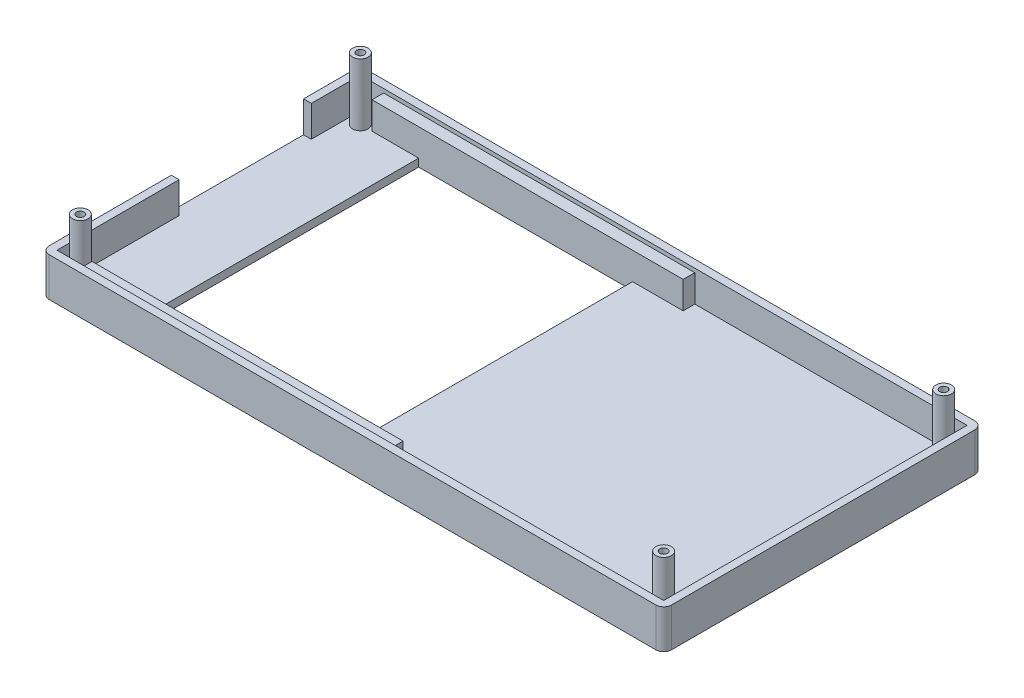
ISO-10303-21;
HEADER;
FILE_DESCRIPTION(('STEP AP214'),'2;1');
FILE_NAME('part.step','',(''),(''),'','','');
FILE_SCHEMA(('AUTOMOTIVE_DESIGN { 1 0 10303 214 1 1 1 1 }'));
ENDSEC;
DATA;
#1=APPLICATION_CONTEXT('core data for automotive mechanical design processes');
#2=APPLICATION_PROTOCOL_DEFINITION('international standard','automotive_design',2000,#1);
#3=PRODUCT_CONTEXT('',#1,'mechanical');
#4=PRODUCT('Part','Part','',(#3));
#5=PRODUCT_RELATED_PRODUCT_CATEGORY('part','',(#4));
#6=PRODUCT_DEFINITION_FORMATION('','',#4);
#7=PRODUCT_DEFINITION_CONTEXT('part definition',#1,'design');
#8=PRODUCT_DEFINITION('design','',#6,#7);
#9=PRODUCT_DEFINITION_SHAPE('','',#8);
#10=(LENGTH_UNIT() NAMED_UNIT(*) SI_UNIT(.MILLI.,.METRE.));
#11=(NAMED_UNIT(*) PLANE_ANGLE_UNIT() SI_UNIT($,.RADIAN.));
#12=(NAMED_UNIT(*) SI_UNIT($,.STERADIAN.) SOLID_ANGLE_UNIT());
#13=UNCERTAINTY_MEASURE_WITH_UNIT(LENGTH_MEASURE(1.E-05),#10,'distance_accuracy_value','');
#14=(GEOMETRIC_REPRESENTATION_CONTEXT(3) GLOBAL_UNCERTAINTY_ASSIGNED_CONTEXT((#13)) GLOBAL_UNIT_ASSIGNED_CONTEXT((#10,
#11,#12)) REPRESENTATION_CONTEXT('',''));
#15=CARTESIAN_POINT('',(0.,0.,0.));
#16=DIRECTION('',(0.,0.,1.));
#17=DIRECTION('',(1.,0.,0.));
#18=AXIS2_PLACEMENT_3D('',#15,#16,#17);
#19=CARTESIAN_POINT('',(0.,2.,0.));
#20=DIRECTION('',(0.,-1.,0.));
#21=DIRECTION('',(0.,0.,-1.));
#22=AXIS2_PLACEMENT_3D('',#19,#20,#21);
#23=PLANE('',#22);
#24=CARTESIAN_POINT('',(75.,2.,-36.));
#25=DIRECTION('',(0.,-1.,0.));
#26=DIRECTION('',(0.,0.,-1.));
#27=AXIS2_PLACEMENT_3D('',#24,#25,#26);
#28=CIRCLE('',#27,2.);
#29=CARTESIAN_POINT('',(75.,2.,-38.));
#30=VERTEX_POINT('',#29);
#31=EDGE_CURVE('E323',#30,#30,#28,.T.);
#32=ORIENTED_EDGE('',*,*,#31,.T.);
#33=EDGE_LOOP('',(#32));
#34=FACE_BOUND('',#33,.T.);
#35=CARTESIAN_POINT('',(75.,2.,36.));
#36=DIRECTION('',(0.,-1.,0.));
#37=DIRECTION('',(0.,0.,-1.));
#38=AXIS2_PLACEMENT_3D('',#35,#36,#37);
#39=CIRCLE('',#38,2.);
#40=CARTESIAN_POINT('',(75.,2.,34.));
#41=VERTEX_POINT('',#40);
#42=EDGE_CURVE('E474',#41,#41,#39,.F.);
#43=ORIENTED_EDGE('',*,*,#42,.F.);
#44=EDGE_LOOP('',(#43));
#45=FACE_BOUND('',#44,.T.);
#46=DIRECTION('',(0.,0.,1.));
#47=VECTOR('',#46,1.);
#48=CARTESIAN_POINT('',(-4.99999999999998,2.,-36.));
#49=LINE('',#48,#47);
#50=CARTESIAN_POINT('',(-4.99999999999998,2.,-36.));
#51=VERTEX_POINT('',#50);
#52=CARTESIAN_POINT('',(-4.99999999999997,2.,36.));
#53=VERTEX_POINT('',#52);
#54=EDGE_CURVE('E244',#51,#53,#49,.T.);
#55=ORIENTED_EDGE('',*,*,#54,.T.);
#56=DIRECTION('',(1.,0.,0.));
#57=VECTOR('',#56,1.);
#58=CARTESIAN_POINT('',(-72.,2.,36.));
#59=LINE('',#58,#57);
#60=CARTESIAN_POINT('',(8.,2.,36.));
#61=VERTEX_POINT('',#60);
#62=EDGE_CURVE('E254',#53,#61,#59,.T.);
#63=ORIENTED_EDGE('',*,*,#62,.T.);
#64=DIRECTION('',(0.,0.,-1.));
#65=VECTOR('',#64,1.);
#66=CARTESIAN_POINT('',(8.,2.,39.));
#67=LINE('',#66,#65);
#68=CARTESIAN_POINT('',(8.,2.,39.));
#69=VERTEX_POINT('',#68);
#70=EDGE_CURVE('E266',#69,#61,#67,.T.);
#71=ORIENTED_EDGE('',*,*,#70,.F.);
#72=DIRECTION('',(1.,0.,0.));
#73=VECTOR('',#72,1.);
#74=CARTESIAN_POINT('',(0.,2.,39.));
#75=LINE('',#74,#73);
#76=CARTESIAN_POINT('',(78.,2.,39.));
#77=VERTEX_POINT('',#76);
#78=EDGE_CURVE('E389',#69,#77,#75,.T.);
#79=ORIENTED_EDGE('',*,*,#78,.T.);
#80=DIRECTION('',(0.,0.,-1.));
#81=VECTOR('',#80,1.);
#82=CARTESIAN_POINT('',(78.,2.,0.));
#83=LINE('',#82,#81);
#84=CARTESIAN_POINT('',(78.,2.,-39.));
#85=VERTEX_POINT('',#84);
#86=EDGE_CURVE('E392',#77,#85,#83,.T.);
#87=ORIENTED_EDGE('',*,*,#86,.T.);
#88=DIRECTION('',(1.,0.,0.));
#89=VECTOR('',#88,1.);
#90=CARTESIAN_POINT('',(0.,2.,-39.));
#91=LINE('',#90,#89);
#92=CARTESIAN_POINT('',(7.99999999999999,2.,-39.));
#93=VERTEX_POINT('',#92);
#94=EDGE_CURVE('E375',#93,#85,#91,.T.);
#95=ORIENTED_EDGE('',*,*,#94,.F.);
#96=DIRECTION('',(0.,0.,1.));
#97=VECTOR('',#96,1.);
#98=CARTESIAN_POINT('',(7.99999999999999,2.,-39.));
#99=LINE('',#98,#97);
#100=CARTESIAN_POINT('',(7.99999999999999,2.,-36.));
#101=VERTEX_POINT('',#100);
#102=EDGE_CURVE('E276',#93,#101,#99,.T.);
#103=ORIENTED_EDGE('',*,*,#102,.T.);
#104=DIRECTION('',(1.,0.,0.));
#105=VECTOR('',#104,1.);
#106=CARTESIAN_POINT('',(-72.,2.,-36.));
#107=LINE('',#106,#105);
#108=EDGE_CURVE('E257',#51,#101,#107,.T.);
#109=ORIENTED_EDGE('',*,*,#108,.F.);
#110=EDGE_LOOP('',(#55,#63,#71,#79,#87,#95,#103,#109));
#111=FACE_BOUND('',#110,.T.);
#112=ADVANCED_FACE('F57',(#34,#45,#111),#23,.F.);
#113=CARTESIAN_POINT('',(-75.,2.,-36.));
#114=DIRECTION('',(0.,-1.,0.));
#115=DIRECTION('',(0.,0.,-1.));
#116=AXIS2_PLACEMENT_3D('',#113,#114,#115);
#117=CIRCLE('',#116,2.);
#118=CARTESIAN_POINT('',(-75.,2.,-38.));
#119=VERTEX_POINT('',#118);
#120=EDGE_CURVE('E480',#119,#119,#117,.F.);
#121=ORIENTED_EDGE('',*,*,#120,.F.);
#122=EDGE_LOOP('',(#121));
#123=FACE_BOUND('',#122,.T.);
#124=CARTESIAN_POINT('',(-75.,2.,36.));
#125=DIRECTION('',(0.,-1.,0.));
#126=DIRECTION('',(0.,0.,-1.));
#127=AXIS2_PLACEMENT_3D('',#124,#125,#126);
#128=CIRCLE('',#127,2.);
#129=CARTESIAN_POINT('',(-75.,2.,34.));
#130=VERTEX_POINT('',#129);
#131=EDGE_CURVE('E343',#130,#130,#128,.T.);
#132=ORIENTED_EDGE('',*,*,#131,.T.);
#133=EDGE_LOOP('',(#132));
#134=FACE_BOUND('',#133,.T.);
#135=CARTESIAN_POINT('',(-72.,2.,36.));
#136=VERTEX_POINT('',#135);
#137=CARTESIAN_POINT('',(-60.,2.,36.));
#138=VERTEX_POINT('',#137);
#139=EDGE_CURVE('E265',#136,#138,#59,.T.);
#140=ORIENTED_EDGE('',*,*,#139,.T.);
#141=DIRECTION('',(0.,0.,1.));
#142=VECTOR('',#141,1.);
#143=CARTESIAN_POINT('',(-60.,2.,-36.));
#144=LINE('',#143,#142);
#145=CARTESIAN_POINT('',(-60.,2.,-36.));
#146=VERTEX_POINT('',#145);
#147=EDGE_CURVE('E80',#146,#138,#144,.T.);
#148=ORIENTED_EDGE('',*,*,#147,.F.);
#149=CARTESIAN_POINT('',(-72.,2.,-36.));
#150=VERTEX_POINT('',#149);
#151=EDGE_CURVE('E298',#150,#146,#107,.T.);
#152=ORIENTED_EDGE('',*,*,#151,.F.);
#153=DIRECTION('',(0.,0.,1.));
#154=VECTOR('',#153,1.);
#155=CARTESIAN_POINT('',(-72.,2.,-39.));
#156=LINE('',#155,#154);
#157=CARTESIAN_POINT('',(-72.,2.,-39.));
#158=VERTEX_POINT('',#157);
#159=EDGE_CURVE('E289',#158,#150,#156,.T.);
#160=ORIENTED_EDGE('',*,*,#159,.F.);
#161=CARTESIAN_POINT('',(-78.,2.,-39.));
#162=VERTEX_POINT('',#161);
#163=EDGE_CURVE('E395',#162,#158,#91,.T.);
#164=ORIENTED_EDGE('',*,*,#163,.F.);
#165=DIRECTION('',(0.,0.,-1.));
#166=VECTOR('',#165,1.);
#167=CARTESIAN_POINT('',(-78.,2.,0.));
#168=LINE('',#167,#166);
#169=CARTESIAN_POINT('',(-78.,2.,-26.4));
#170=VERTEX_POINT('',#169);
#171=EDGE_CURVE('E371',#170,#162,#168,.T.);
#172=ORIENTED_EDGE('',*,*,#171,.F.);
#173=DIRECTION('',(-1.,0.,0.));
#174=VECTOR('',#173,1.);
#175=CARTESIAN_POINT('',(-74.,2.,-26.4));
#176=LINE('',#175,#174);
#177=CARTESIAN_POINT('',(-80.,2.,-26.4));
#178=VERTEX_POINT('',#177);
#179=EDGE_CURVE('E357',#170,#178,#176,.T.);
#180=ORIENTED_EDGE('',*,*,#179,.T.);
#181=DIRECTION('',(0.,0.,1.));
#182=VECTOR('',#181,1.);
#183=CARTESIAN_POINT('',(-80.,2.,-26.4));
#184=LINE('',#183,#182);
#185=CARTESIAN_POINT('',(-80.,2.,7.60000000000001));
#186=VERTEX_POINT('',#185);
#187=EDGE_CURVE('E354',#178,#186,#184,.T.);
#188=ORIENTED_EDGE('',*,*,#187,.T.);
#189=DIRECTION('',(-1.,0.,0.));
#190=VECTOR('',#189,1.);
#191=CARTESIAN_POINT('',(-74.,2.,7.60000000000001));
#192=LINE('',#191,#190);
#193=CARTESIAN_POINT('',(-78.,2.,7.60000000000001));
#194=VERTEX_POINT('',#193);
#195=EDGE_CURVE('E359',#194,#186,#192,.T.);
#196=ORIENTED_EDGE('',*,*,#195,.F.);
#197=CARTESIAN_POINT('',(-78.,2.,39.));
#198=VERTEX_POINT('',#197);
#199=EDGE_CURVE('E372',#198,#194,#168,.T.);
#200=ORIENTED_EDGE('',*,*,#199,.F.);
#201=CARTESIAN_POINT('',(-72.,2.,39.));
#202=VERTEX_POINT('',#201);
#203=EDGE_CURVE('E385',#198,#202,#75,.T.);
#204=ORIENTED_EDGE('',*,*,#203,.T.);
#205=DIRECTION('',(0.,0.,-1.));
#206=VECTOR('',#205,1.);
#207=CARTESIAN_POINT('',(-72.,2.,39.));
#208=LINE('',#207,#206);
#209=EDGE_CURVE('E269',#202,#136,#208,.T.);
#210=ORIENTED_EDGE('',*,*,#209,.T.);
#211=EDGE_LOOP('',(#140,#148,#152,#160,#164,#172,#180,#188,#196,#200,#204,#210));
#212=FACE_BOUND('',#211,.T.);
#213=ADVANCED_FACE('F512',(#123,#134,#212),#23,.F.);
#214=CARTESIAN_POINT('',(-80.,10.,-39.));
#215=DIRECTION('',(0.,0.,-1.));
#216=DIRECTION('',(-1.,0.,0.));
#217=AXIS2_PLACEMENT_3D('',#214,#215,#216);
#218=PLANE('',#217);
#219=DIRECTION('',(0.,-1.,0.));
#220=VECTOR('',#219,1.);
#221=CARTESIAN_POINT('',(-72.,9.,-39.));
#222=LINE('',#221,#220);
#223=CARTESIAN_POINT('',(-72.,9.,-39.));
#224=VERTEX_POINT('',#223);
#225=EDGE_CURVE('E303',#224,#158,#222,.T.);
#226=ORIENTED_EDGE('',*,*,#225,.F.);
#227=DIRECTION('',(1.,0.,0.));
#228=VECTOR('',#227,1.);
#229=CARTESIAN_POINT('',(-72.,9.,-39.));
#230=LINE('',#229,#228);
#231=CARTESIAN_POINT('',(7.99999999999999,9.,-39.));
#232=VERTEX_POINT('',#231);
#233=EDGE_CURVE('E286',#224,#232,#230,.T.);
#234=ORIENTED_EDGE('',*,*,#233,.T.);
#235=DIRECTION('',(0.,-1.,0.));
#236=VECTOR('',#235,1.);
#237=CARTESIAN_POINT('',(7.99999999999999,9.,-39.));
#238=LINE('',#237,#236);
#239=EDGE_CURVE('E296',#232,#93,#238,.T.);
#240=ORIENTED_EDGE('',*,*,#239,.T.);
#241=ORIENTED_EDGE('',*,*,#94,.T.);
#242=DIRECTION('',(0.,-1.,0.));
#243=VECTOR('',#242,1.);
#244=CARTESIAN_POINT('',(78.,10.,-39.));
#245=LINE('',#244,#243);
#246=CARTESIAN_POINT('',(78.,10.,-39.));
#247=VERTEX_POINT('',#246);
#248=EDGE_CURVE('E383',#247,#85,#245,.T.);
#249=ORIENTED_EDGE('',*,*,#248,.F.);
#250=DIRECTION('',(1.,0.,0.));
#251=VECTOR('',#250,1.);
#252=CARTESIAN_POINT('',(0.,10.,-39.));
#253=LINE('',#252,#251);
#254=CARTESIAN_POINT('',(-78.,10.,-39.));
#255=VERTEX_POINT('',#254);
#256=EDGE_CURVE('E403',#255,#247,#253,.T.);
#257=ORIENTED_EDGE('',*,*,#256,.F.);
#258=DIRECTION('',(0.,-1.,0.));
#259=VECTOR('',#258,1.);
#260=CARTESIAN_POINT('',(-78.,10.,-39.));
#261=LINE('',#260,#259);
#262=EDGE_CURVE('E380',#255,#162,#261,.T.);
#263=ORIENTED_EDGE('',*,*,#262,.T.);
#264=ORIENTED_EDGE('',*,*,#163,.T.);
#265=EDGE_LOOP('',(#226,#234,#240,#241,#249,#257,#263,#264));
#266=FACE_BOUND('',#265,.T.);
#267=ADVANCED_FACE('F531',(#266),#218,.F.);
#268=CARTESIAN_POINT('',(-80.,10.,41.));
#269=DIRECTION('',(-1.,0.,0.));
#270=DIRECTION('',(0.,0.,1.));
#271=AXIS2_PLACEMENT_3D('',#268,#269,#270);
#272=PLANE('',#271);
#273=ORIENTED_EDGE('',*,*,#187,.F.);
#274=DIRECTION('',(0.,1.,0.));
#275=VECTOR('',#274,1.);
#276=CARTESIAN_POINT('',(-80.,2.,-26.4));
#277=LINE('',#276,#275);
#278=CARTESIAN_POINT('',(-80.,10.,-26.4));
#279=VERTEX_POINT('',#278);
#280=EDGE_CURVE('E347',#178,#279,#277,.T.);
#281=ORIENTED_EDGE('',*,*,#280,.T.);
#282=DIRECTION('',(0.,0.,-1.));
#283=VECTOR('',#282,1.);
#284=CARTESIAN_POINT('',(-80.,10.,41.));
#285=LINE('',#284,#283);
#286=CARTESIAN_POINT('',(-80.,10.,-39.));
#287=VERTEX_POINT('',#286);
#288=EDGE_CURVE('E414',#279,#287,#285,.T.);
#289=ORIENTED_EDGE('',*,*,#288,.T.);
#290=DIRECTION('',(0.,-1.,0.));
#291=VECTOR('',#290,1.);
#292=CARTESIAN_POINT('',(-80.,10.,-39.));
#293=LINE('',#292,#291);
#294=CARTESIAN_POINT('',(-80.,0.,-39.));
#295=VERTEX_POINT('',#294);
#296=EDGE_CURVE('E441',#287,#295,#293,.T.);
#297=ORIENTED_EDGE('',*,*,#296,.T.);
#298=DIRECTION('',(0.,0.,-1.));
#299=VECTOR('',#298,1.);
#300=CARTESIAN_POINT('',(-80.,0.,41.));
#301=LINE('',#300,#299);
#302=CARTESIAN_POINT('',(-80.,0.,39.));
#303=VERTEX_POINT('',#302);
#304=EDGE_CURVE('E378',#303,#295,#301,.T.);
#305=ORIENTED_EDGE('',*,*,#304,.F.);
#306=DIRECTION('',(0.,-1.,0.));
#307=VECTOR('',#306,1.);
#308=CARTESIAN_POINT('',(-80.,10.,39.));
#309=LINE('',#308,#307);
#310=CARTESIAN_POINT('',(-80.,10.,39.));
#311=VERTEX_POINT('',#310);
#312=EDGE_CURVE('E437',#303,#311,#309,.F.);
#313=ORIENTED_EDGE('',*,*,#312,.T.);
#314=CARTESIAN_POINT('',(-80.,10.,7.60000000000001));
#315=VERTEX_POINT('',#314);
#316=EDGE_CURVE('E410',#311,#315,#285,.T.);
#317=ORIENTED_EDGE('',*,*,#316,.T.);
#318=DIRECTION('',(0.,1.,0.));
#319=VECTOR('',#318,1.);
#320=CARTESIAN_POINT('',(-80.,2.,7.60000000000001));
#321=LINE('',#320,#319);
#322=EDGE_CURVE('E352',#186,#315,#321,.T.);
#323=ORIENTED_EDGE('',*,*,#322,.F.);
#324=EDGE_LOOP('',(#273,#281,#289,#297,#305,#313,#317,#323));
#325=FACE_BOUND('',#324,.T.);
#326=ADVANCED_FACE('F666',(#325),#272,.T.);
#327=CARTESIAN_POINT('',(0.,10.,0.));
#328=DIRECTION('',(0.,-1.,0.));
#329=DIRECTION('',(0.,0.,-1.));
#330=AXIS2_PLACEMENT_3D('',#327,#328,#329);
#331=PLANE('',#330);
#332=DIRECTION('',(-1.,0.,0.));
#333=VECTOR('',#332,1.);
#334=CARTESIAN_POINT('',(0.,10.,-26.4));
#335=LINE('',#334,#333);
#336=CARTESIAN_POINT('',(-78.,10.,-26.4));
#337=VERTEX_POINT('',#336);
#338=EDGE_CURVE('E369',#337,#279,#335,.T.);
#339=ORIENTED_EDGE('',*,*,#338,.F.);
#340=DIRECTION('',(0.,0.,-1.));
#341=VECTOR('',#340,1.);
#342=CARTESIAN_POINT('',(-78.,10.,0.));
#343=LINE('',#342,#341);
#344=EDGE_CURVE('E388',#337,#255,#343,.T.);
#345=ORIENTED_EDGE('',*,*,#344,.T.);
#346=ORIENTED_EDGE('',*,*,#256,.T.);
#347=DIRECTION('',(0.,0.,-1.));
#348=VECTOR('',#347,1.);
#349=CARTESIAN_POINT('',(78.,10.,0.));
#350=LINE('',#349,#348);
#351=CARTESIAN_POINT('',(78.,10.,39.));
#352=VERTEX_POINT('',#351);
#353=EDGE_CURVE('E405',#352,#247,#350,.T.);
#354=ORIENTED_EDGE('',*,*,#353,.F.);
#355=DIRECTION('',(1.,0.,0.));
#356=VECTOR('',#355,1.);
#357=CARTESIAN_POINT('',(0.,10.,39.));
#358=LINE('',#357,#356);
#359=CARTESIAN_POINT('',(-78.,10.,39.));
#360=VERTEX_POINT('',#359);
#361=EDGE_CURVE('E384',#360,#352,#358,.T.);
#362=ORIENTED_EDGE('',*,*,#361,.F.);
#363=CARTESIAN_POINT('',(-78.,10.,7.60000000000001));
#364=VERTEX_POINT('',#363);
#365=EDGE_CURVE('E400',#360,#364,#343,.T.);
#366=ORIENTED_EDGE('',*,*,#365,.T.);
#367=DIRECTION('',(-1.,0.,0.));
#368=VECTOR('',#367,1.);
#369=CARTESIAN_POINT('',(0.,10.,7.60000000000001));
#370=LINE('',#369,#368);
#371=EDGE_CURVE('E364',#364,#315,#370,.T.);
#372=ORIENTED_EDGE('',*,*,#371,.T.);
#373=ORIENTED_EDGE('',*,*,#316,.F.);
#374=CARTESIAN_POINT('',(-78.,10.,39.));
#375=DIRECTION('',(0.,-1.,0.));
#376=DIRECTION('',(0.,0.,-1.));
#377=AXIS2_PLACEMENT_3D('',#374,#375,#376);
#378=CIRCLE('',#377,2.);
#379=CARTESIAN_POINT('',(-78.,10.,41.));
#380=VERTEX_POINT('',#379);
#381=EDGE_CURVE('E439',#311,#380,#378,.F.);
#382=ORIENTED_EDGE('',*,*,#381,.T.);
#383=DIRECTION('',(1.,0.,0.));
#384=VECTOR('',#383,1.);
#385=CARTESIAN_POINT('',(-80.,10.,41.));
#386=LINE('',#385,#384);
#387=CARTESIAN_POINT('',(78.,10.,41.));
#388=VERTEX_POINT('',#387);
#389=EDGE_CURVE('E419',#380,#388,#386,.T.);
#390=ORIENTED_EDGE('',*,*,#389,.T.);
#391=CARTESIAN_POINT('',(78.,10.,39.));
#392=DIRECTION('',(0.,-1.,0.));
#393=DIRECTION('',(0.,0.,-1.));
#394=AXIS2_PLACEMENT_3D('',#391,#392,#393);
#395=CIRCLE('',#394,2.);
#396=CARTESIAN_POINT('',(80.,10.,39.));
#397=VERTEX_POINT('',#396);
#398=EDGE_CURVE('E469',#388,#397,#395,.F.);
#399=ORIENTED_EDGE('',*,*,#398,.T.);
#400=DIRECTION('',(0.,0.,-1.));
#401=VECTOR('',#400,1.);
#402=CARTESIAN_POINT('',(80.,10.,41.));
#403=LINE('',#402,#401);
#404=CARTESIAN_POINT('',(80.,10.,-39.));
#405=VERTEX_POINT('',#404);
#406=EDGE_CURVE('E417',#397,#405,#403,.T.);
#407=ORIENTED_EDGE('',*,*,#406,.T.);
#408=CARTESIAN_POINT('',(78.,10.,-39.));
#409=DIRECTION('',(0.,-1.,0.));
#410=DIRECTION('',(0.,0.,-1.));
#411=AXIS2_PLACEMENT_3D('',#408,#409,#410);
#412=CIRCLE('',#411,2.);
#413=CARTESIAN_POINT('',(78.,10.,-41.));
#414=VERTEX_POINT('',#413);
#415=EDGE_CURVE('E460',#405,#414,#412,.F.);
#416=ORIENTED_EDGE('',*,*,#415,.T.);
#417=DIRECTION('',(1.,0.,0.));
#418=VECTOR('',#417,1.);
#419=CARTESIAN_POINT('',(-80.,10.,-41.));
#420=LINE('',#419,#418);
#421=CARTESIAN_POINT('',(-78.,10.,-41.));
#422=VERTEX_POINT('',#421);
#423=EDGE_CURVE('E413',#422,#414,#420,.T.);
#424=ORIENTED_EDGE('',*,*,#423,.F.);
#425=CARTESIAN_POINT('',(-78.,10.,-39.));
#426=DIRECTION('',(0.,-1.,0.));
#427=DIRECTION('',(0.,0.,-1.));
#428=AXIS2_PLACEMENT_3D('',#425,#426,#427);
#429=CIRCLE('',#428,2.);
#430=EDGE_CURVE('E448',#422,#287,#429,.F.);
#431=ORIENTED_EDGE('',*,*,#430,.T.);
#432=ORIENTED_EDGE('',*,*,#288,.F.);
#433=EDGE_LOOP('',(#339,#345,#346,#354,#362,#366,#372,#373,#382,#390,#399,#407,#416,#424,#431,#432));
#434=FACE_BOUND('',#433,.T.);
#435=ADVANCED_FACE('F526',(#434),#331,.F.);
#436=CARTESIAN_POINT('',(-78.,10.,41.));
#437=DIRECTION('',(-1.,0.,0.));
#438=DIRECTION('',(0.,0.,1.));
#439=AXIS2_PLACEMENT_3D('',#436,#437,#438);
#440=PLANE('',#439);
#441=DIRECTION('',(0.,1.,0.));
#442=VECTOR('',#441,1.);
#443=CARTESIAN_POINT('',(-78.,10.,-26.4));
#444=LINE('',#443,#442);
#445=EDGE_CURVE('E367',#170,#337,#444,.T.);
#446=ORIENTED_EDGE('',*,*,#445,.F.);
#447=ORIENTED_EDGE('',*,*,#171,.T.);
#448=ORIENTED_EDGE('',*,*,#262,.F.);
#449=ORIENTED_EDGE('',*,*,#344,.F.);
#450=EDGE_LOOP('',(#446,#447,#448,#449));
#451=FACE_BOUND('',#450,.T.);
#452=ADVANCED_FACE('F660',(#451),#440,.F.);
#453=CARTESIAN_POINT('',(-80.,10.,41.));
#454=DIRECTION('',(0.,0.,-1.));
#455=DIRECTION('',(-1.,0.,0.));
#456=AXIS2_PLACEMENT_3D('',#453,#454,#455);
#457=PLANE('',#456);
#458=DIRECTION('',(1.,0.,0.));
#459=VECTOR('',#458,1.);
#460=CARTESIAN_POINT('',(-80.,0.,41.));
#461=LINE('',#460,#459);
#462=CARTESIAN_POINT('',(-78.,0.,41.));
#463=VERTEX_POINT('',#462);
#464=CARTESIAN_POINT('',(78.,0.,41.));
#465=VERTEX_POINT('',#464);
#466=EDGE_CURVE('E430',#463,#465,#461,.T.);
#467=ORIENTED_EDGE('',*,*,#466,.T.);
#468=DIRECTION('',(0.,-1.,0.));
#469=VECTOR('',#468,1.);
#470=CARTESIAN_POINT('',(78.,10.,41.));
#471=LINE('',#470,#469);
#472=EDGE_CURVE('E467',#465,#388,#471,.F.);
#473=ORIENTED_EDGE('',*,*,#472,.T.);
#474=ORIENTED_EDGE('',*,*,#389,.F.);
#475=DIRECTION('',(0.,-1.,0.));
#476=VECTOR('',#475,1.);
#477=CARTESIAN_POINT('',(-78.,0.,41.));
#478=LINE('',#477,#476);
#479=EDGE_CURVE('E422',#380,#463,#478,.T.);
#480=ORIENTED_EDGE('',*,*,#479,.T.);
#481=EDGE_LOOP('',(#467,#473,#474,#480));
#482=FACE_BOUND('',#481,.T.);
#483=ADVANCED_FACE('F716',(#482),#457,.F.);
#484=CARTESIAN_POINT('',(80.,10.,41.));
#485=DIRECTION('',(-1.,0.,0.));
#486=DIRECTION('',(0.,0.,1.));
#487=AXIS2_PLACEMENT_3D('',#484,#485,#486);
#488=PLANE('',#487);
#489=ORIENTED_EDGE('',*,*,#406,.F.);
#490=DIRECTION('',(0.,-1.,0.));
#491=VECTOR('',#490,1.);
#492=CARTESIAN_POINT('',(80.,10.,39.));
#493=LINE('',#492,#491);
#494=CARTESIAN_POINT('',(80.,0.,39.));
#495=VERTEX_POINT('',#494);
#496=EDGE_CURVE('E462',#397,#495,#493,.T.);
#497=ORIENTED_EDGE('',*,*,#496,.T.);
#498=DIRECTION('',(0.,0.,-1.));
#499=VECTOR('',#498,1.);
#500=CARTESIAN_POINT('',(80.,0.,41.));
#501=LINE('',#500,#499);
#502=CARTESIAN_POINT('',(80.,0.,-39.));
#503=VERTEX_POINT('',#502);
#504=EDGE_CURVE('E428',#495,#503,#501,.T.);
#505=ORIENTED_EDGE('',*,*,#504,.T.);
#506=DIRECTION('',(0.,-1.,0.));
#507=VECTOR('',#506,1.);
#508=CARTESIAN_POINT('',(80.,10.,-39.));
#509=LINE('',#508,#507);
#510=EDGE_CURVE('E457',#503,#405,#509,.F.);
#511=ORIENTED_EDGE('',*,*,#510,.T.);
#512=EDGE_LOOP('',(#489,#497,#505,#511));
#513=FACE_BOUND('',#512,.T.);
#514=ADVANCED_FACE('F722',(#513),#488,.F.);
#515=CARTESIAN_POINT('',(-80.,10.,-41.));
#516=DIRECTION('',(0.,0.,-1.));
#517=DIRECTION('',(-1.,0.,0.));
#518=AXIS2_PLACEMENT_3D('',#515,#516,#517);
#519=PLANE('',#518);
#520=ORIENTED_EDGE('',*,*,#423,.T.);
#521=DIRECTION('',(0.,-1.,0.));
#522=VECTOR('',#521,1.);
#523=CARTESIAN_POINT('',(78.,0.,-41.));
#524=LINE('',#523,#522);
#525=CARTESIAN_POINT('',(78.,0.,-41.));
#526=VERTEX_POINT('',#525);
#527=EDGE_CURVE('E451',#414,#526,#524,.T.);
#528=ORIENTED_EDGE('',*,*,#527,.T.);
#529=DIRECTION('',(1.,0.,0.));
#530=VECTOR('',#529,1.);
#531=CARTESIAN_POINT('',(-80.,0.,-41.));
#532=LINE('',#531,#530);
#533=CARTESIAN_POINT('',(-78.,0.,-41.));
#534=VERTEX_POINT('',#533);
#535=EDGE_CURVE('E425',#534,#526,#532,.T.);
#536=ORIENTED_EDGE('',*,*,#535,.F.);
#537=DIRECTION('',(0.,-1.,0.));
#538=VECTOR('',#537,1.);
#539=CARTESIAN_POINT('',(-78.,10.,-41.));
#540=LINE('',#539,#538);
#541=EDGE_CURVE('E446',#534,#422,#540,.F.);
#542=ORIENTED_EDGE('',*,*,#541,.T.);
#543=EDGE_LOOP('',(#520,#528,#536,#542));
#544=FACE_BOUND('',#543,.T.);
#545=ADVANCED_FACE('F678',(#544),#519,.T.);
#546=CARTESIAN_POINT('',(0.,0.,0.));
#547=DIRECTION('',(0.,-1.,0.));
#548=DIRECTION('',(0.,0.,-1.));
#549=AXIS2_PLACEMENT_3D('',#546,#547,#548);
#550=PLANE('',#549);
#551=DIRECTION('',(0.,0.,-1.));
#552=VECTOR('',#551,1.);
#553=CARTESIAN_POINT('',(-60.,0.,0.));
#554=LINE('',#553,#552);
#555=CARTESIAN_POINT('',(-60.,0.,36.));
#556=VERTEX_POINT('',#555);
#557=CARTESIAN_POINT('',(-60.,0.,-36.));
#558=VERTEX_POINT('',#557);
#559=EDGE_CURVE('E12',#556,#558,#554,.T.);
#560=ORIENTED_EDGE('',*,*,#559,.F.);
#561=DIRECTION('',(-1.,0.,0.));
#562=VECTOR('',#561,1.);
#563=CARTESIAN_POINT('',(0.,0.,36.));
#564=LINE('',#563,#562);
#565=CARTESIAN_POINT('',(-4.99999999999997,0.,36.));
#566=VERTEX_POINT('',#565);
#567=EDGE_CURVE('E483',#566,#556,#564,.T.);
#568=ORIENTED_EDGE('',*,*,#567,.F.);
#569=DIRECTION('',(0.,0.,-1.));
#570=VECTOR('',#569,1.);
#571=CARTESIAN_POINT('',(-4.99999999999997,0.,0.));
#572=LINE('',#571,#570);
#573=CARTESIAN_POINT('',(-4.99999999999998,0.,-36.));
#574=VERTEX_POINT('',#573);
#575=EDGE_CURVE('E247',#566,#574,#572,.T.);
#576=ORIENTED_EDGE('',*,*,#575,.T.);
#577=DIRECTION('',(-1.,0.,0.));
#578=VECTOR('',#577,1.);
#579=CARTESIAN_POINT('',(0.,0.,-36.));
#580=LINE('',#579,#578);
#581=EDGE_CURVE('E65',#574,#558,#580,.T.);
#582=ORIENTED_EDGE('',*,*,#581,.T.);
#583=EDGE_LOOP('',(#560,#568,#576,#582));
#584=FACE_BOUND('',#583,.T.);
#585=ORIENTED_EDGE('',*,*,#504,.F.);
#586=CARTESIAN_POINT('',(78.,0.,39.));
#587=DIRECTION('',(0.,-1.,0.));
#588=DIRECTION('',(0.,0.,-1.));
#589=AXIS2_PLACEMENT_3D('',#586,#587,#588);
#590=CIRCLE('',#589,2.);
#591=EDGE_CURVE('E465',#495,#465,#590,.T.);
#592=ORIENTED_EDGE('',*,*,#591,.T.);
#593=ORIENTED_EDGE('',*,*,#466,.F.);
#594=CARTESIAN_POINT('',(-78.,0.,39.));
#595=DIRECTION('',(0.,-1.,0.));
#596=DIRECTION('',(0.,0.,-1.));
#597=AXIS2_PLACEMENT_3D('',#594,#595,#596);
#598=CIRCLE('',#597,2.);
#599=EDGE_CURVE('E435',#463,#303,#598,.T.);
#600=ORIENTED_EDGE('',*,*,#599,.T.);
#601=ORIENTED_EDGE('',*,*,#304,.T.);
#602=CARTESIAN_POINT('',(-78.,0.,-39.));
#603=DIRECTION('',(0.,-1.,0.));
#604=DIRECTION('',(0.,0.,-1.));
#605=AXIS2_PLACEMENT_3D('',#602,#603,#604);
#606=CIRCLE('',#605,2.);
#607=EDGE_CURVE('E444',#295,#534,#606,.T.);
#608=ORIENTED_EDGE('',*,*,#607,.T.);
#609=ORIENTED_EDGE('',*,*,#535,.T.);
#610=CARTESIAN_POINT('',(78.,0.,-39.));
#611=DIRECTION('',(0.,-1.,0.));
#612=DIRECTION('',(0.,0.,-1.));
#613=AXIS2_PLACEMENT_3D('',#610,#611,#612);
#614=CIRCLE('',#613,2.);
#615=EDGE_CURVE('E454',#526,#503,#614,.T.);
#616=ORIENTED_EDGE('',*,*,#615,.T.);
#617=EDGE_LOOP('',(#585,#592,#593,#600,#601,#608,#609,#616));
#618=FACE_BOUND('',#617,.T.);
#619=ADVANCED_FACE('F488',(#584,#618),#550,.T.);
#620=ORIENTED_EDGE('',*,*,#199,.T.);
#621=DIRECTION('',(0.,1.,0.));
#622=VECTOR('',#621,1.);
#623=CARTESIAN_POINT('',(-78.,10.,7.60000000000001));
#624=LINE('',#623,#622);
#625=EDGE_CURVE('E361',#194,#364,#624,.T.);
#626=ORIENTED_EDGE('',*,*,#625,.T.);
#627=ORIENTED_EDGE('',*,*,#365,.F.);
#628=DIRECTION('',(0.,-1.,0.));
#629=VECTOR('',#628,1.);
#630=CARTESIAN_POINT('',(-78.,10.,39.));
#631=LINE('',#630,#629);
#632=EDGE_CURVE('E376',#360,#198,#631,.T.);
#633=ORIENTED_EDGE('',*,*,#632,.T.);
#634=EDGE_LOOP('',(#620,#626,#627,#633));
#635=FACE_BOUND('',#634,.T.);
#636=ADVANCED_FACE('F515',(#635),#440,.F.);
#637=CARTESIAN_POINT('',(-80.,10.,39.));
#638=DIRECTION('',(0.,0.,-1.));
#639=DIRECTION('',(-1.,0.,0.));
#640=AXIS2_PLACEMENT_3D('',#637,#638,#639);
#641=PLANE('',#640);
#642=DIRECTION('',(0.,-1.,0.));
#643=VECTOR('',#642,1.);
#644=CARTESIAN_POINT('',(-72.,9.,39.));
#645=LINE('',#644,#643);
#646=CARTESIAN_POINT('',(-72.,9.,39.));
#647=VERTEX_POINT('',#646);
#648=EDGE_CURVE('E495',#647,#202,#645,.T.);
#649=ORIENTED_EDGE('',*,*,#648,.T.);
#650=ORIENTED_EDGE('',*,*,#203,.F.);
#651=ORIENTED_EDGE('',*,*,#632,.F.);
#652=ORIENTED_EDGE('',*,*,#361,.T.);
#653=DIRECTION('',(0.,-1.,0.));
#654=VECTOR('',#653,1.);
#655=CARTESIAN_POINT('',(78.,10.,39.));
#656=LINE('',#655,#654);
#657=EDGE_CURVE('E379',#352,#77,#656,.T.);
#658=ORIENTED_EDGE('',*,*,#657,.T.);
#659=ORIENTED_EDGE('',*,*,#78,.F.);
#660=DIRECTION('',(0.,-1.,0.));
#661=VECTOR('',#660,1.);
#662=CARTESIAN_POINT('',(8.,9.,39.));
#663=LINE('',#662,#661);
#664=CARTESIAN_POINT('',(8.,9.,39.));
#665=VERTEX_POINT('',#664);
#666=EDGE_CURVE('E501',#665,#69,#663,.T.);
#667=ORIENTED_EDGE('',*,*,#666,.F.);
#668=DIRECTION('',(1.,0.,0.));
#669=VECTOR('',#668,1.);
#670=CARTESIAN_POINT('',(-72.,9.,39.));
#671=LINE('',#670,#669);
#672=EDGE_CURVE('E277',#647,#665,#671,.T.);
#673=ORIENTED_EDGE('',*,*,#672,.F.);
#674=EDGE_LOOP('',(#649,#650,#651,#652,#658,#659,#667,#673));
#675=FACE_BOUND('',#674,.T.);
#676=ADVANCED_FACE('F507',(#675),#641,.T.);
#677=CARTESIAN_POINT('',(78.,10.,41.));
#678=DIRECTION('',(-1.,0.,0.));
#679=DIRECTION('',(0.,0.,1.));
#680=AXIS2_PLACEMENT_3D('',#677,#678,#679);
#681=PLANE('',#680);
#682=ORIENTED_EDGE('',*,*,#86,.F.);
#683=ORIENTED_EDGE('',*,*,#657,.F.);
#684=ORIENTED_EDGE('',*,*,#353,.T.);
#685=ORIENTED_EDGE('',*,*,#248,.T.);
#686=EDGE_LOOP('',(#682,#683,#684,#685));
#687=FACE_BOUND('',#686,.T.);
#688=ADVANCED_FACE('F524',(#687),#681,.T.);
#689=CARTESIAN_POINT('',(-78.,10.,39.));
#690=DIRECTION('',(0.,1.,0.));
#691=DIRECTION('',(0.,0.,1.));
#692=AXIS2_PLACEMENT_3D('',#689,#690,#691);
#693=CYLINDRICAL_SURFACE('',#692,2.);
#694=ORIENTED_EDGE('',*,*,#381,.F.);
#695=ORIENTED_EDGE('',*,*,#312,.F.);
#696=ORIENTED_EDGE('',*,*,#599,.F.);
#697=ORIENTED_EDGE('',*,*,#479,.F.);
#698=EDGE_LOOP('',(#694,#695,#696,#697));
#699=FACE_BOUND('',#698,.T.);
#700=ADVANCED_FACE('F664',(#699),#693,.T.);
#701=CARTESIAN_POINT('',(-78.,10.,-39.));
#702=DIRECTION('',(0.,-1.,0.));
#703=DIRECTION('',(0.,0.,-1.));
#704=AXIS2_PLACEMENT_3D('',#701,#702,#703);
#705=CYLINDRICAL_SURFACE('',#704,2.);
#706=ORIENTED_EDGE('',*,*,#430,.F.);
#707=ORIENTED_EDGE('',*,*,#541,.F.);
#708=ORIENTED_EDGE('',*,*,#607,.F.);
#709=ORIENTED_EDGE('',*,*,#296,.F.);
#710=EDGE_LOOP('',(#706,#707,#708,#709));
#711=FACE_BOUND('',#710,.T.);
#712=ADVANCED_FACE('F682',(#711),#705,.T.);
#713=CARTESIAN_POINT('',(78.,10.,-39.));
#714=DIRECTION('',(0.,1.,0.));
#715=DIRECTION('',(0.,0.,1.));
#716=AXIS2_PLACEMENT_3D('',#713,#714,#715);
#717=CYLINDRICAL_SURFACE('',#716,2.);
#718=ORIENTED_EDGE('',*,*,#415,.F.);
#719=ORIENTED_EDGE('',*,*,#510,.F.);
#720=ORIENTED_EDGE('',*,*,#615,.F.);
#721=ORIENTED_EDGE('',*,*,#527,.F.);
#722=EDGE_LOOP('',(#718,#719,#720,#721));
#723=FACE_BOUND('',#722,.T.);
#724=ADVANCED_FACE('F685',(#723),#717,.T.);
#725=CARTESIAN_POINT('',(78.,10.,39.));
#726=DIRECTION('',(0.,-1.,0.));
#727=DIRECTION('',(0.,0.,-1.));
#728=AXIS2_PLACEMENT_3D('',#725,#726,#727);
#729=CYLINDRICAL_SURFACE('',#728,2.);
#730=ORIENTED_EDGE('',*,*,#398,.F.);
#731=ORIENTED_EDGE('',*,*,#472,.F.);
#732=ORIENTED_EDGE('',*,*,#591,.F.);
#733=ORIENTED_EDGE('',*,*,#496,.F.);
#734=EDGE_LOOP('',(#730,#731,#732,#733));
#735=FACE_BOUND('',#734,.T.);
#736=ADVANCED_FACE('F59',(#735),#729,.T.);
#737=CARTESIAN_POINT('',(-74.,2.,-26.4));
#738=DIRECTION('',(0.,0.,1.));
#739=DIRECTION('',(1.,0.,0.));
#740=AXIS2_PLACEMENT_3D('',#737,#738,#739);
#741=PLANE('',#740);
#742=ORIENTED_EDGE('',*,*,#338,.T.);
#743=ORIENTED_EDGE('',*,*,#280,.F.);
#744=ORIENTED_EDGE('',*,*,#179,.F.);
#745=ORIENTED_EDGE('',*,*,#445,.T.);
#746=EDGE_LOOP('',(#742,#743,#744,#745));
#747=FACE_BOUND('',#746,.T.);
#748=ADVANCED_FACE('F653',(#747),#741,.T.);
#749=CARTESIAN_POINT('',(-74.,2.,7.60000000000001));
#750=DIRECTION('',(0.,0.,1.));
#751=DIRECTION('',(1.,0.,0.));
#752=AXIS2_PLACEMENT_3D('',#749,#750,#751);
#753=PLANE('',#752);
#754=ORIENTED_EDGE('',*,*,#625,.F.);
#755=ORIENTED_EDGE('',*,*,#195,.T.);
#756=ORIENTED_EDGE('',*,*,#322,.T.);
#757=ORIENTED_EDGE('',*,*,#371,.F.);
#758=EDGE_LOOP('',(#754,#755,#756,#757));
#759=FACE_BOUND('',#758,.T.);
#760=ADVANCED_FACE('F649',(#759),#753,.F.);
#761=CARTESIAN_POINT('',(-75.,18.,36.));
#762=DIRECTION('',(0.,-1.,0.));
#763=DIRECTION('',(0.,0.,-1.));
#764=AXIS2_PLACEMENT_3D('',#761,#762,#763);
#765=CYLINDRICAL_SURFACE('',#764,2.);
#766=CARTESIAN_POINT('',(-75.,18.,36.));
#767=DIRECTION('',(0.,-1.,0.));
#768=DIRECTION('',(0.,0.,-1.));
#769=AXIS2_PLACEMENT_3D('',#766,#767,#768);
#770=CIRCLE('',#769,2.);
#771=CARTESIAN_POINT('',(-75.,18.,34.));
#772=VERTEX_POINT('',#771);
#773=EDGE_CURVE('E344',#772,#772,#770,.T.);
#774=ORIENTED_EDGE('',*,*,#773,.T.);
#775=EDGE_LOOP('',(#774));
#776=FACE_BOUND('',#775,.T.);
#777=ORIENTED_EDGE('',*,*,#131,.F.);
#778=EDGE_LOOP('',(#777));
#779=FACE_BOUND('',#778,.T.);
#780=ADVANCED_FACE('F645',(#776,#779),#765,.T.);
#781=CARTESIAN_POINT('',(-75.,18.,36.));
#782=DIRECTION('',(0.,-1.,0.));
#783=DIRECTION('',(0.,0.,-1.));
#784=AXIS2_PLACEMENT_3D('',#781,#782,#783);
#785=PLANE('',#784);
#786=CARTESIAN_POINT('',(-75.,18.,36.));
#787=DIRECTION('',(0.,-1.,0.));
#788=DIRECTION('',(0.,0.,-1.));
#789=AXIS2_PLACEMENT_3D('',#786,#787,#788);
#790=CIRCLE('',#789,0.999999999999998);
#791=CARTESIAN_POINT('',(-75.,18.,35.));
#792=VERTEX_POINT('',#791);
#793=EDGE_CURVE('E338',#792,#792,#790,.T.);
#794=ORIENTED_EDGE('',*,*,#793,.T.);
#795=EDGE_LOOP('',(#794));
#796=FACE_BOUND('',#795,.T.);
#797=ORIENTED_EDGE('',*,*,#773,.F.);
#798=EDGE_LOOP('',(#797));
#799=FACE_BOUND('',#798,.T.);
#800=ADVANCED_FACE('F605',(#796,#799),#785,.F.);
#801=CARTESIAN_POINT('',(-75.,18.,36.));
#802=DIRECTION('',(0.,-1.,0.));
#803=DIRECTION('',(0.,0.,-1.));
#804=AXIS2_PLACEMENT_3D('',#801,#802,#803);
#805=CYLINDRICAL_SURFACE('',#804,0.999999999999998);
#806=ORIENTED_EDGE('',*,*,#793,.F.);
#807=EDGE_LOOP('',(#806));
#808=FACE_BOUND('',#807,.T.);
#809=CARTESIAN_POINT('',(-75.,2.,36.));
#810=DIRECTION('',(0.,-1.,0.));
#811=DIRECTION('',(0.,0.,-1.));
#812=AXIS2_PLACEMENT_3D('',#809,#810,#811);
#813=CIRCLE('',#812,0.999999999999998);
#814=CARTESIAN_POINT('',(-75.,2.,35.));
#815=VERTEX_POINT('',#814);
#816=EDGE_CURVE('E471',#815,#815,#813,.T.);
#817=ORIENTED_EDGE('',*,*,#816,.T.);
#818=EDGE_LOOP('',(#817));
#819=FACE_BOUND('',#818,.T.);
#820=ADVANCED_FACE('F596',(#808,#819),#805,.F.);
#821=ORIENTED_EDGE('',*,*,#816,.F.);
#822=EDGE_LOOP('',(#821));
#823=FACE_BOUND('',#822,.T.);
#824=ADVANCED_FACE('F583',(#823),#23,.F.);
#825=CARTESIAN_POINT('',(75.,18.,36.));
#826=DIRECTION('',(0.,1.,0.));
#827=DIRECTION('',(0.,0.,1.));
#828=AXIS2_PLACEMENT_3D('',#825,#826,#827);
#829=PLANE('',#828);
#830=CARTESIAN_POINT('',(75.,18.,36.));
#831=DIRECTION('',(0.,1.,0.));
#832=DIRECTION('',(0.,0.,1.));
#833=AXIS2_PLACEMENT_3D('',#830,#831,#832);
#834=CIRCLE('',#833,2.);
#835=CARTESIAN_POINT('',(75.,18.,38.));
#836=VERTEX_POINT('',#835);
#837=EDGE_CURVE('E331',#836,#836,#834,.T.);
#838=ORIENTED_EDGE('',*,*,#837,.T.);
#839=EDGE_LOOP('',(#838));
#840=FACE_BOUND('',#839,.T.);
#841=CARTESIAN_POINT('',(75.,18.,36.));
#842=DIRECTION('',(0.,1.,0.));
#843=DIRECTION('',(0.,0.,1.));
#844=AXIS2_PLACEMENT_3D('',#841,#842,#843);
#845=CIRCLE('',#844,0.999999999999998);
#846=CARTESIAN_POINT('',(75.,18.,37.));
#847=VERTEX_POINT('',#846);
#848=EDGE_CURVE('E334',#847,#847,#845,.T.);
#849=ORIENTED_EDGE('',*,*,#848,.F.);
#850=EDGE_LOOP('',(#849));
#851=FACE_BOUND('',#850,.T.);
#852=ADVANCED_FACE('F595',(#840,#851),#829,.T.);
#853=CARTESIAN_POINT('',(75.,18.,36.));
#854=DIRECTION('',(0.,-1.,0.));
#855=DIRECTION('',(0.,0.,-1.));
#856=AXIS2_PLACEMENT_3D('',#853,#854,#855);
#857=CYLINDRICAL_SURFACE('',#856,2.);
#858=ORIENTED_EDGE('',*,*,#837,.F.);
#859=EDGE_LOOP('',(#858));
#860=FACE_BOUND('',#859,.T.);
#861=ORIENTED_EDGE('',*,*,#42,.T.);
#862=EDGE_LOOP('',(#861));
#863=FACE_BOUND('',#862,.T.);
#864=ADVANCED_FACE('F591',(#860,#863),#857,.T.);
#865=CARTESIAN_POINT('',(75.,18.,36.));
#866=DIRECTION('',(0.,-1.,0.));
#867=DIRECTION('',(0.,0.,-1.));
#868=AXIS2_PLACEMENT_3D('',#865,#866,#867);
#869=CYLINDRICAL_SURFACE('',#868,0.999999999999998);
#870=ORIENTED_EDGE('',*,*,#848,.T.);
#871=EDGE_LOOP('',(#870));
#872=FACE_BOUND('',#871,.T.);
#873=CARTESIAN_POINT('',(75.,2.,36.));
#874=DIRECTION('',(0.,1.,0.));
#875=DIRECTION('',(0.,0.,1.));
#876=AXIS2_PLACEMENT_3D('',#873,#874,#875);
#877=CIRCLE('',#876,0.999999999999998);
#878=CARTESIAN_POINT('',(75.,2.,37.));
#879=VERTEX_POINT('',#878);
#880=EDGE_CURVE('E335',#879,#879,#877,.T.);
#881=ORIENTED_EDGE('',*,*,#880,.F.);
#882=EDGE_LOOP('',(#881));
#883=FACE_BOUND('',#882,.T.);
#884=ADVANCED_FACE('F581',(#872,#883),#869,.F.);
#885=ORIENTED_EDGE('',*,*,#880,.T.);
#886=EDGE_LOOP('',(#885));
#887=FACE_BOUND('',#886,.T.);
#888=ADVANCED_FACE('F570',(#887),#23,.F.);
#889=CARTESIAN_POINT('',(75.,18.,-36.));
#890=DIRECTION('',(0.,-1.,0.));
#891=DIRECTION('',(0.,0.,-1.));
#892=AXIS2_PLACEMENT_3D('',#889,#890,#891);
#893=CYLINDRICAL_SURFACE('',#892,2.);
#894=CARTESIAN_POINT('',(75.,18.,-36.));
#895=DIRECTION('',(0.,-1.,0.));
#896=DIRECTION('',(0.,0.,-1.));
#897=AXIS2_PLACEMENT_3D('',#894,#895,#896);
#898=CIRCLE('',#897,2.);
#899=CARTESIAN_POINT('',(75.,18.,-38.));
#900=VERTEX_POINT('',#899);
#901=EDGE_CURVE('E320',#900,#900,#898,.T.);
#902=ORIENTED_EDGE('',*,*,#901,.T.);
#903=EDGE_LOOP('',(#902));
#904=FACE_BOUND('',#903,.T.);
#905=ORIENTED_EDGE('',*,*,#31,.F.);
#906=EDGE_LOOP('',(#905));
#907=FACE_BOUND('',#906,.T.);
#908=ADVANCED_FACE('F580',(#904,#907),#893,.T.);
#909=CARTESIAN_POINT('',(75.,18.,-36.));
#910=DIRECTION('',(0.,-1.,0.));
#911=DIRECTION('',(0.,0.,-1.));
#912=AXIS2_PLACEMENT_3D('',#909,#910,#911);
#913=PLANE('',#912);
#914=CARTESIAN_POINT('',(75.,18.,-36.));
#915=DIRECTION('',(0.,-1.,0.));
#916=DIRECTION('',(0.,0.,-1.));
#917=AXIS2_PLACEMENT_3D('',#914,#915,#916);
#918=CIRCLE('',#917,0.999999999999998);
#919=CARTESIAN_POINT('',(75.,18.,-37.));
#920=VERTEX_POINT('',#919);
#921=EDGE_CURVE('E326',#920,#920,#918,.T.);
#922=ORIENTED_EDGE('',*,*,#921,.T.);
#923=EDGE_LOOP('',(#922));
#924=FACE_BOUND('',#923,.T.);
#925=ORIENTED_EDGE('',*,*,#901,.F.);
#926=EDGE_LOOP('',(#925));
#927=FACE_BOUND('',#926,.T.);
#928=ADVANCED_FACE('F588',(#924,#927),#913,.F.);
#929=CARTESIAN_POINT('',(75.,18.,-36.));
#930=DIRECTION('',(0.,-1.,0.));
#931=DIRECTION('',(0.,0.,-1.));
#932=AXIS2_PLACEMENT_3D('',#929,#930,#931);
#933=CYLINDRICAL_SURFACE('',#932,0.999999999999998);
#934=ORIENTED_EDGE('',*,*,#921,.F.);
#935=EDGE_LOOP('',(#934));
#936=FACE_BOUND('',#935,.T.);
#937=CARTESIAN_POINT('',(75.,2.,-36.));
#938=DIRECTION('',(0.,-1.,0.));
#939=DIRECTION('',(0.,0.,-1.));
#940=AXIS2_PLACEMENT_3D('',#937,#938,#939);
#941=CIRCLE('',#940,0.999999999999998);
#942=CARTESIAN_POINT('',(75.,2.,-37.));
#943=VERTEX_POINT('',#942);
#944=EDGE_CURVE('E477',#943,#943,#941,.T.);
#945=ORIENTED_EDGE('',*,*,#944,.T.);
#946=EDGE_LOOP('',(#945));
#947=FACE_BOUND('',#946,.T.);
#948=ADVANCED_FACE('F621',(#936,#947),#933,.F.);
#949=ORIENTED_EDGE('',*,*,#944,.F.);
#950=EDGE_LOOP('',(#949));
#951=FACE_BOUND('',#950,.T.);
#952=ADVANCED_FACE('F575',(#951),#23,.F.);
#953=CARTESIAN_POINT('',(-75.,18.,-36.));
#954=DIRECTION('',(0.,1.,0.));
#955=DIRECTION('',(0.,0.,1.));
#956=AXIS2_PLACEMENT_3D('',#953,#954,#955);
#957=PLANE('',#956);
#958=CARTESIAN_POINT('',(-75.,18.,-36.));
#959=DIRECTION('',(0.,1.,0.));
#960=DIRECTION('',(0.,0.,1.));
#961=AXIS2_PLACEMENT_3D('',#958,#959,#960);
#962=CIRCLE('',#961,2.);
#963=CARTESIAN_POINT('',(-75.,18.,-34.));
#964=VERTEX_POINT('',#963);
#965=EDGE_CURVE('E306',#964,#964,#962,.T.);
#966=ORIENTED_EDGE('',*,*,#965,.T.);
#967=EDGE_LOOP('',(#966));
#968=FACE_BOUND('',#967,.T.);
#969=CARTESIAN_POINT('',(-75.,18.,-36.));
#970=DIRECTION('',(0.,1.,0.));
#971=DIRECTION('',(0.,0.,1.));
#972=AXIS2_PLACEMENT_3D('',#969,#970,#971);
#973=CIRCLE('',#972,0.999999999999998);
#974=CARTESIAN_POINT('',(-75.,18.,-35.));
#975=VERTEX_POINT('',#974);
#976=EDGE_CURVE('E316',#975,#975,#973,.T.);
#977=ORIENTED_EDGE('',*,*,#976,.F.);
#978=EDGE_LOOP('',(#977));
#979=FACE_BOUND('',#978,.T.);
#980=ADVANCED_FACE('F620',(#968,#979),#957,.T.);
#981=CARTESIAN_POINT('',(-75.,18.,-36.));
#982=DIRECTION('',(0.,-1.,0.));
#983=DIRECTION('',(0.,0.,-1.));
#984=AXIS2_PLACEMENT_3D('',#981,#982,#983);
#985=CYLINDRICAL_SURFACE('',#984,2.);
#986=ORIENTED_EDGE('',*,*,#965,.F.);
#987=EDGE_LOOP('',(#986));
#988=FACE_BOUND('',#987,.T.);
#989=ORIENTED_EDGE('',*,*,#120,.T.);
#990=EDGE_LOOP('',(#989));
#991=FACE_BOUND('',#990,.T.);
#992=ADVANCED_FACE('F616',(#988,#991),#985,.T.);
#993=CARTESIAN_POINT('',(-75.,18.,-36.));
#994=DIRECTION('',(0.,-1.,0.));
#995=DIRECTION('',(0.,0.,-1.));
#996=AXIS2_PLACEMENT_3D('',#993,#994,#995);
#997=CYLINDRICAL_SURFACE('',#996,0.999999999999998);
#998=ORIENTED_EDGE('',*,*,#976,.T.);
#999=EDGE_LOOP('',(#998));
#1000=FACE_BOUND('',#999,.T.);
#1001=CARTESIAN_POINT('',(-75.,2.,-36.));
#1002=DIRECTION('',(0.,1.,0.));
#1003=DIRECTION('',(0.,0.,1.));
#1004=AXIS2_PLACEMENT_3D('',#1001,#1002,#1003);
#1005=CIRCLE('',#1004,0.999999999999998);
#1006=CARTESIAN_POINT('',(-75.,2.,-35.));
#1007=VERTEX_POINT('',#1006);
#1008=EDGE_CURVE('E317',#1007,#1007,#1005,.T.);
#1009=ORIENTED_EDGE('',*,*,#1008,.F.);
#1010=EDGE_LOOP('',(#1009));
#1011=FACE_BOUND('',#1010,.T.);
#1012=ADVANCED_FACE('F610',(#1000,#1011),#997,.F.);
#1013=ORIENTED_EDGE('',*,*,#1008,.T.);
#1014=EDGE_LOOP('',(#1013));
#1015=FACE_BOUND('',#1014,.T.);
#1016=ADVANCED_FACE('F598',(#1015),#23,.F.);
#1017=CARTESIAN_POINT('',(-72.,9.,-39.));
#1018=DIRECTION('',(1.,0.,0.));
#1019=DIRECTION('',(0.,0.,-1.));
#1020=AXIS2_PLACEMENT_3D('',#1017,#1018,#1019);
#1021=PLANE('',#1020);
#1022=ORIENTED_EDGE('',*,*,#159,.T.);
#1023=DIRECTION('',(0.,-1.,0.));
#1024=VECTOR('',#1023,1.);
#1025=CARTESIAN_POINT('',(-72.,9.,-36.));
#1026=LINE('',#1025,#1024);
#1027=CARTESIAN_POINT('',(-72.,9.,-36.));
#1028=VERTEX_POINT('',#1027);
#1029=EDGE_CURVE('E307',#1028,#150,#1026,.T.);
#1030=ORIENTED_EDGE('',*,*,#1029,.F.);
#1031=DIRECTION('',(0.,0.,1.));
#1032=VECTOR('',#1031,1.);
#1033=CARTESIAN_POINT('',(-72.,9.,-39.));
#1034=LINE('',#1033,#1032);
#1035=EDGE_CURVE('E294',#224,#1028,#1034,.T.);
#1036=ORIENTED_EDGE('',*,*,#1035,.F.);
#1037=ORIENTED_EDGE('',*,*,#225,.T.);
#1038=EDGE_LOOP('',(#1022,#1030,#1036,#1037));
#1039=FACE_BOUND('',#1038,.T.);
#1040=ADVANCED_FACE('F548',(#1039),#1021,.F.);
#1041=CARTESIAN_POINT('',(-72.,9.,-36.));
#1042=DIRECTION('',(0.,0.,-1.));
#1043=DIRECTION('',(-1.,0.,0.));
#1044=AXIS2_PLACEMENT_3D('',#1041,#1042,#1043);
#1045=PLANE('',#1044);
#1046=ORIENTED_EDGE('',*,*,#151,.T.);
#1047=DIRECTION('',(0.,1.,0.));
#1048=VECTOR('',#1047,1.);
#1049=CARTESIAN_POINT('',(-60.,-198.,-36.));
#1050=LINE('',#1049,#1048);
#1051=EDGE_CURVE('E493',#558,#146,#1050,.T.);
#1052=ORIENTED_EDGE('',*,*,#1051,.F.);
#1053=ORIENTED_EDGE('',*,*,#581,.F.);
#1054=DIRECTION('',(0.,1.,0.));
#1055=VECTOR('',#1054,1.);
#1056=CARTESIAN_POINT('',(-4.99999999999998,-198.,-36.));
#1057=LINE('',#1056,#1055);
#1058=EDGE_CURVE('E249',#574,#51,#1057,.T.);
#1059=ORIENTED_EDGE('',*,*,#1058,.T.);
#1060=ORIENTED_EDGE('',*,*,#108,.T.);
#1061=DIRECTION('',(0.,-1.,0.));
#1062=VECTOR('',#1061,1.);
#1063=CARTESIAN_POINT('',(7.99999999999999,9.,-36.));
#1064=LINE('',#1063,#1062);
#1065=CARTESIAN_POINT('',(7.99999999999999,9.,-36.));
#1066=VERTEX_POINT('',#1065);
#1067=EDGE_CURVE('E310',#1066,#101,#1064,.T.);
#1068=ORIENTED_EDGE('',*,*,#1067,.F.);
#1069=DIRECTION('',(1.,0.,0.));
#1070=VECTOR('',#1069,1.);
#1071=CARTESIAN_POINT('',(-72.,9.,-36.));
#1072=LINE('',#1071,#1070);
#1073=EDGE_CURVE('E292',#1028,#1066,#1072,.T.);
#1074=ORIENTED_EDGE('',*,*,#1073,.F.);
#1075=ORIENTED_EDGE('',*,*,#1029,.T.);
#1076=EDGE_LOOP('',(#1046,#1052,#1053,#1059,#1060,#1068,#1074,#1075));
#1077=FACE_BOUND('',#1076,.T.);
#1078=ADVANCED_FACE('F492',(#1077),#1045,.F.);
#1079=CARTESIAN_POINT('',(7.99999999999999,9.,-39.));
#1080=DIRECTION('',(1.,0.,0.));
#1081=DIRECTION('',(0.,0.,-1.));
#1082=AXIS2_PLACEMENT_3D('',#1079,#1080,#1081);
#1083=PLANE('',#1082);
#1084=ORIENTED_EDGE('',*,*,#102,.F.);
#1085=ORIENTED_EDGE('',*,*,#239,.F.);
#1086=DIRECTION('',(0.,0.,1.));
#1087=VECTOR('',#1086,1.);
#1088=CARTESIAN_POINT('',(7.99999999999999,9.,-39.));
#1089=LINE('',#1088,#1087);
#1090=EDGE_CURVE('E288',#232,#1066,#1089,.T.);
#1091=ORIENTED_EDGE('',*,*,#1090,.T.);
#1092=ORIENTED_EDGE('',*,*,#1067,.T.);
#1093=EDGE_LOOP('',(#1084,#1085,#1091,#1092));
#1094=FACE_BOUND('',#1093,.T.);
#1095=ADVANCED_FACE('F555',(#1094),#1083,.T.);
#1096=CARTESIAN_POINT('',(0.,9.,0.));
#1097=DIRECTION('',(0.,-1.,0.));
#1098=DIRECTION('',(0.,0.,-1.));
#1099=AXIS2_PLACEMENT_3D('',#1096,#1097,#1098);
#1100=PLANE('',#1099);
#1101=ORIENTED_EDGE('',*,*,#233,.F.);
#1102=ORIENTED_EDGE('',*,*,#1035,.T.);
#1103=ORIENTED_EDGE('',*,*,#1073,.T.);
#1104=ORIENTED_EDGE('',*,*,#1090,.F.);
#1105=EDGE_LOOP('',(#1101,#1102,#1103,#1104));
#1106=FACE_BOUND('',#1105,.T.);
#1107=ADVANCED_FACE('F556',(#1106),#1100,.F.);
#1108=CARTESIAN_POINT('',(-72.,9.,39.));
#1109=DIRECTION('',(-1.,0.,0.));
#1110=DIRECTION('',(0.,0.,1.));
#1111=AXIS2_PLACEMENT_3D('',#1108,#1109,#1110);
#1112=PLANE('',#1111);
#1113=ORIENTED_EDGE('',*,*,#209,.F.);
#1114=ORIENTED_EDGE('',*,*,#648,.F.);
#1115=DIRECTION('',(0.,0.,-1.));
#1116=VECTOR('',#1115,1.);
#1117=CARTESIAN_POINT('',(-72.,9.,39.));
#1118=LINE('',#1117,#1116);
#1119=CARTESIAN_POINT('',(-72.,9.,36.));
#1120=VERTEX_POINT('',#1119);
#1121=EDGE_CURVE('E270',#647,#1120,#1118,.T.);
#1122=ORIENTED_EDGE('',*,*,#1121,.T.);
#1123=DIRECTION('',(0.,-1.,0.));
#1124=VECTOR('',#1123,1.);
#1125=CARTESIAN_POINT('',(-72.,9.,36.));
#1126=LINE('',#1125,#1124);
#1127=EDGE_CURVE('E280',#1120,#136,#1126,.T.);
#1128=ORIENTED_EDGE('',*,*,#1127,.T.);
#1129=EDGE_LOOP('',(#1113,#1114,#1122,#1128));
#1130=FACE_BOUND('',#1129,.T.);
#1131=ADVANCED_FACE('F541',(#1130),#1112,.T.);
#1132=CARTESIAN_POINT('',(8.,9.,39.));
#1133=DIRECTION('',(-1.,0.,0.));
#1134=DIRECTION('',(0.,0.,1.));
#1135=AXIS2_PLACEMENT_3D('',#1132,#1133,#1134);
#1136=PLANE('',#1135);
#1137=ORIENTED_EDGE('',*,*,#70,.T.);
#1138=DIRECTION('',(0.,-1.,0.));
#1139=VECTOR('',#1138,1.);
#1140=CARTESIAN_POINT('',(8.,9.,36.));
#1141=LINE('',#1140,#1139);
#1142=CARTESIAN_POINT('',(8.,9.,36.));
#1143=VERTEX_POINT('',#1142);
#1144=EDGE_CURVE('E263',#1143,#61,#1141,.T.);
#1145=ORIENTED_EDGE('',*,*,#1144,.F.);
#1146=DIRECTION('',(0.,0.,-1.));
#1147=VECTOR('',#1146,1.);
#1148=CARTESIAN_POINT('',(8.,9.,39.));
#1149=LINE('',#1148,#1147);
#1150=EDGE_CURVE('E279',#665,#1143,#1149,.T.);
#1151=ORIENTED_EDGE('',*,*,#1150,.F.);
#1152=ORIENTED_EDGE('',*,*,#666,.T.);
#1153=EDGE_LOOP('',(#1137,#1145,#1151,#1152));
#1154=FACE_BOUND('',#1153,.T.);
#1155=ADVANCED_FACE('F537',(#1154),#1136,.F.);
#1156=CARTESIAN_POINT('',(-72.,9.,36.));
#1157=DIRECTION('',(0.,0.,-1.));
#1158=DIRECTION('',(-1.,0.,0.));
#1159=AXIS2_PLACEMENT_3D('',#1156,#1157,#1158);
#1160=PLANE('',#1159);
#1161=ORIENTED_EDGE('',*,*,#139,.F.);
#1162=ORIENTED_EDGE('',*,*,#1127,.F.);
#1163=DIRECTION('',(1.,0.,0.));
#1164=VECTOR('',#1163,1.);
#1165=CARTESIAN_POINT('',(-72.,9.,36.));
#1166=LINE('',#1165,#1164);
#1167=EDGE_CURVE('E282',#1120,#1143,#1166,.T.);
#1168=ORIENTED_EDGE('',*,*,#1167,.T.);
#1169=ORIENTED_EDGE('',*,*,#1144,.T.);
#1170=ORIENTED_EDGE('',*,*,#62,.F.);
#1171=DIRECTION('',(0.,1.,0.));
#1172=VECTOR('',#1171,1.);
#1173=CARTESIAN_POINT('',(-4.99999999999997,-198.,36.));
#1174=LINE('',#1173,#1172);
#1175=EDGE_CURVE('E72',#566,#53,#1174,.T.);
#1176=ORIENTED_EDGE('',*,*,#1175,.F.);
#1177=ORIENTED_EDGE('',*,*,#567,.T.);
#1178=DIRECTION('',(0.,1.,0.));
#1179=VECTOR('',#1178,1.);
#1180=CARTESIAN_POINT('',(-60.,-198.,36.));
#1181=LINE('',#1180,#1179);
#1182=EDGE_CURVE('E250',#556,#138,#1181,.T.);
#1183=ORIENTED_EDGE('',*,*,#1182,.T.);
#1184=EDGE_LOOP('',(#1161,#1162,#1168,#1169,#1170,#1176,#1177,#1183));
#1185=FACE_BOUND('',#1184,.T.);
#1186=ADVANCED_FACE('F260',(#1185),#1160,.T.);
#1187=CARTESIAN_POINT('',(0.,9.,0.));
#1188=DIRECTION('',(0.,-1.,0.));
#1189=DIRECTION('',(0.,0.,-1.));
#1190=AXIS2_PLACEMENT_3D('',#1187,#1188,#1189);
#1191=PLANE('',#1190);
#1192=ORIENTED_EDGE('',*,*,#1121,.F.);
#1193=ORIENTED_EDGE('',*,*,#672,.T.);
#1194=ORIENTED_EDGE('',*,*,#1150,.T.);
#1195=ORIENTED_EDGE('',*,*,#1167,.F.);
#1196=EDGE_LOOP('',(#1192,#1193,#1194,#1195));
#1197=FACE_BOUND('',#1196,.T.);
#1198=ADVANCED_FACE('F540',(#1197),#1191,.F.);
#1199=CARTESIAN_POINT('',(-60.,-198.,-36.));
#1200=DIRECTION('',(-1.,0.,0.));
#1201=DIRECTION('',(0.,0.,1.));
#1202=AXIS2_PLACEMENT_3D('',#1199,#1200,#1201);
#1203=PLANE('',#1202);
#1204=ORIENTED_EDGE('',*,*,#559,.T.);
#1205=ORIENTED_EDGE('',*,*,#1051,.T.);
#1206=ORIENTED_EDGE('',*,*,#147,.T.);
#1207=ORIENTED_EDGE('',*,*,#1182,.F.);
#1208=EDGE_LOOP('',(#1204,#1205,#1206,#1207));
#1209=FACE_BOUND('',#1208,.T.);
#1210=ADVANCED_FACE('F964',(#1209),#1203,.F.);
#1211=CARTESIAN_POINT('',(-4.99999999999998,-198.,-36.));
#1212=DIRECTION('',(-1.,0.,0.));
#1213=DIRECTION('',(0.,0.,1.));
#1214=AXIS2_PLACEMENT_3D('',#1211,#1212,#1213);
#1215=PLANE('',#1214);
#1216=ORIENTED_EDGE('',*,*,#1175,.T.);
#1217=ORIENTED_EDGE('',*,*,#54,.F.);
#1218=ORIENTED_EDGE('',*,*,#1058,.F.);
#1219=ORIENTED_EDGE('',*,*,#575,.F.);
#1220=EDGE_LOOP('',(#1216,#1217,#1218,#1219));
#1221=FACE_BOUND('',#1220,.T.);
#1222=ADVANCED_FACE('F242',(#1221),#1215,.T.);
#1223=CLOSED_SHELL('',(#112,#213,#267,#326,#435,#452,#483,#514,#545,#619,#636,#676,#688,#700,
#712,#724,#736,#748,#760,#780,#800,#820,#824,#852,#864,#884,#888,#908,#928,#948,#952,#980,#992,
#1012,#1016,#1040,#1078,#1095,#1107,#1131,#1155,#1186,#1198,#1210,#1222));
#1224=MANIFOLD_SOLID_BREP('B2',#1223);
#1225=ADVANCED_BREP_SHAPE_REPRESENTATION('',(#18,#1224),#14);
#1226=SHAPE_DEFINITION_REPRESENTATION(#9,#1225);
ENDSEC;
END-ISO-10303-21;
